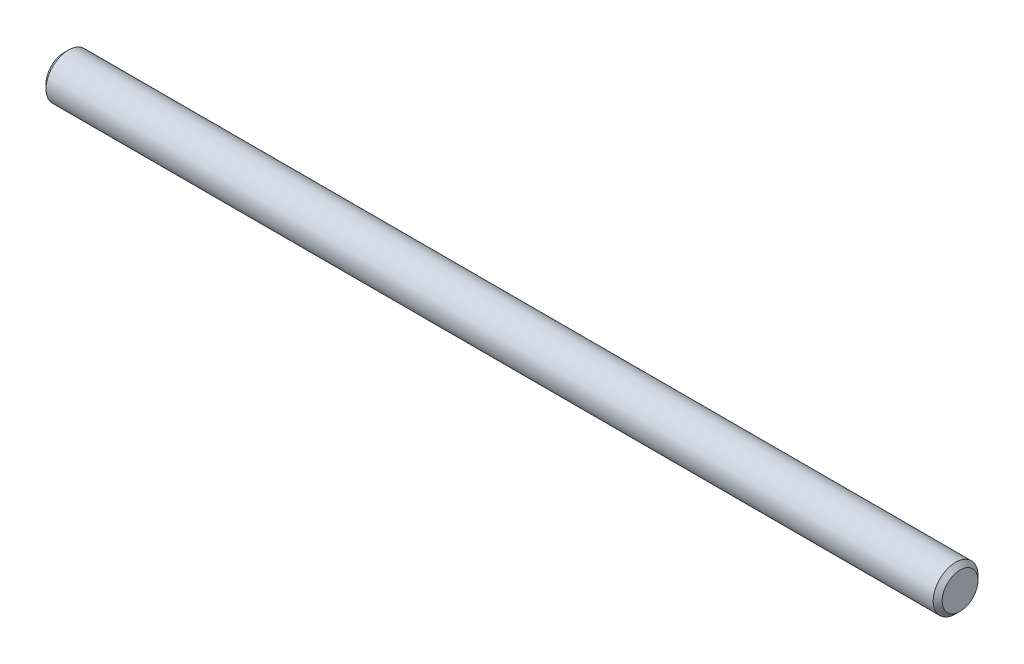
ISO-10303-21;
HEADER;
FILE_DESCRIPTION(('STEP AP214'),'2;1');
FILE_NAME('part.step','',(''),(''),'','','');
FILE_SCHEMA(('AUTOMOTIVE_DESIGN { 1 0 10303 214 1 1 1 1 }'));
ENDSEC;
DATA;
#1=APPLICATION_CONTEXT('core data for automotive mechanical design processes');
#2=APPLICATION_PROTOCOL_DEFINITION('international standard','automotive_design',2000,#1);
#3=PRODUCT_CONTEXT('',#1,'mechanical');
#4=PRODUCT('Part','Part','',(#3));
#5=PRODUCT_RELATED_PRODUCT_CATEGORY('part','',(#4));
#6=PRODUCT_DEFINITION_FORMATION('','',#4);
#7=PRODUCT_DEFINITION_CONTEXT('part definition',#1,'design');
#8=PRODUCT_DEFINITION('design','',#6,#7);
#9=PRODUCT_DEFINITION_SHAPE('','',#8);
#10=(LENGTH_UNIT() NAMED_UNIT(*) SI_UNIT(.MILLI.,.METRE.));
#11=(NAMED_UNIT(*) PLANE_ANGLE_UNIT() SI_UNIT($,.RADIAN.));
#12=(NAMED_UNIT(*) SI_UNIT($,.STERADIAN.) SOLID_ANGLE_UNIT());
#13=UNCERTAINTY_MEASURE_WITH_UNIT(LENGTH_MEASURE(1.E-05),#10,'distance_accuracy_value','');
#14=(GEOMETRIC_REPRESENTATION_CONTEXT(3) GLOBAL_UNCERTAINTY_ASSIGNED_CONTEXT((#13)) GLOBAL_UNIT_ASSIGNED_CONTEXT((#10,
#11,#12)) REPRESENTATION_CONTEXT('',''));
#15=CARTESIAN_POINT('',(0.,0.,0.));
#16=DIRECTION('',(0.,0.,1.));
#17=DIRECTION('',(1.,0.,0.));
#18=AXIS2_PLACEMENT_3D('',#15,#16,#17);
#19=CARTESIAN_POINT('',(-7.9375,0.,0.));
#20=DIRECTION('',(1.,0.,0.));
#21=DIRECTION('',(0.,0.,-1.));
#22=AXIS2_PLACEMENT_3D('',#19,#20,#21);
#23=CYLINDRICAL_SURFACE('',#22,0.396875);
#24=CARTESIAN_POINT('',(7.858125,0.,0.));
#25=DIRECTION('',(1.,0.,0.));
#26=DIRECTION('',(0.,0.,-1.));
#27=AXIS2_PLACEMENT_3D('',#24,#25,#26);
#28=CIRCLE('',#27,0.396875);
#29=CARTESIAN_POINT('',(7.858125,0.,-0.396875));
#30=VERTEX_POINT('',#29);
#31=EDGE_CURVE('E40',#30,#30,#28,.F.);
#32=ORIENTED_EDGE('',*,*,#31,.T.);
#33=EDGE_LOOP('',(#32));
#34=FACE_BOUND('',#33,.T.);
#35=CARTESIAN_POINT('',(-7.858125,0.,0.));
#36=DIRECTION('',(1.,0.,0.));
#37=DIRECTION('',(0.,0.,-1.));
#38=AXIS2_PLACEMENT_3D('',#35,#36,#37);
#39=CIRCLE('',#38,0.396875);
#40=CARTESIAN_POINT('',(-7.858125,0.,-0.396875));
#41=VERTEX_POINT('',#40);
#42=EDGE_CURVE('E46',#41,#41,#39,.T.);
#43=ORIENTED_EDGE('',*,*,#42,.T.);
#44=EDGE_LOOP('',(#43));
#45=FACE_BOUND('',#44,.T.);
#46=ADVANCED_FACE('F32',(#34,#45),#23,.T.);
#47=CARTESIAN_POINT('',(-7.9375,0.,0.));
#48=DIRECTION('',(1.,0.,0.));
#49=DIRECTION('',(0.,0.,-1.));
#50=AXIS2_PLACEMENT_3D('',#47,#48,#49);
#51=PLANE('',#50);
#52=CARTESIAN_POINT('',(-7.9375,0.,0.));
#53=DIRECTION('',(1.,0.,0.));
#54=DIRECTION('',(0.,0.,-1.));
#55=AXIS2_PLACEMENT_3D('',#52,#53,#54);
#56=CIRCLE('',#55,0.317499999999997);
#57=CARTESIAN_POINT('',(-7.9375,0.,-0.317499999999997));
#58=VERTEX_POINT('',#57);
#59=EDGE_CURVE('E10',#58,#58,#56,.F.);
#60=ORIENTED_EDGE('',*,*,#59,.T.);
#61=EDGE_LOOP('',(#60));
#62=FACE_BOUND('',#61,.T.);
#63=ADVANCED_FACE('F67',(#62),#51,.F.);
#64=CARTESIAN_POINT('',(7.9375,0.,0.));
#65=DIRECTION('',(1.,0.,0.));
#66=DIRECTION('',(0.,0.,-1.));
#67=AXIS2_PLACEMENT_3D('',#64,#65,#66);
#68=PLANE('',#67);
#69=CARTESIAN_POINT('',(7.9375,0.,0.));
#70=DIRECTION('',(1.,0.,0.));
#71=DIRECTION('',(0.,0.,-1.));
#72=AXIS2_PLACEMENT_3D('',#69,#70,#71);
#73=CIRCLE('',#72,0.3175);
#74=CARTESIAN_POINT('',(7.9375,0.,-0.3175));
#75=VERTEX_POINT('',#74);
#76=EDGE_CURVE('E51',#75,#75,#73,.T.);
#77=ORIENTED_EDGE('',*,*,#76,.T.);
#78=EDGE_LOOP('',(#77));
#79=FACE_BOUND('',#78,.T.);
#80=ADVANCED_FACE('F57',(#79),#68,.T.);
#81=CARTESIAN_POINT('',(7.9375,0.,0.));
#82=DIRECTION('',(-1.,0.,0.));
#83=DIRECTION('',(0.,0.,1.));
#84=AXIS2_PLACEMENT_3D('',#81,#82,#83);
#85=CONICAL_SURFACE('',#84,0.3175,0.785398163397451);
#86=ORIENTED_EDGE('',*,*,#31,.F.);
#87=EDGE_LOOP('',(#86));
#88=FACE_BOUND('',#87,.T.);
#89=ORIENTED_EDGE('',*,*,#76,.F.);
#90=EDGE_LOOP('',(#89));
#91=FACE_BOUND('',#90,.T.);
#92=ADVANCED_FACE('F59',(#88,#91),#85,.T.);
#93=CARTESIAN_POINT('',(-7.858125,0.,0.));
#94=DIRECTION('',(1.,0.,0.));
#95=DIRECTION('',(0.,0.,-1.));
#96=AXIS2_PLACEMENT_3D('',#93,#94,#95);
#97=CONICAL_SURFACE('',#96,0.396875,0.785398163397451);
#98=ORIENTED_EDGE('',*,*,#59,.F.);
#99=EDGE_LOOP('',(#98));
#100=FACE_BOUND('',#99,.T.);
#101=ORIENTED_EDGE('',*,*,#42,.F.);
#102=EDGE_LOOP('',(#101));
#103=FACE_BOUND('',#102,.T.);
#104=ADVANCED_FACE('F34',(#100,#103),#97,.T.);
#105=CLOSED_SHELL('',(#46,#63,#80,#92,#104));
#106=MANIFOLD_SOLID_BREP('B2',#105);
#107=ADVANCED_BREP_SHAPE_REPRESENTATION('',(#18,#106),#14);
#108=SHAPE_DEFINITION_REPRESENTATION(#9,#107);
ENDSEC;
END-ISO-10303-21;
